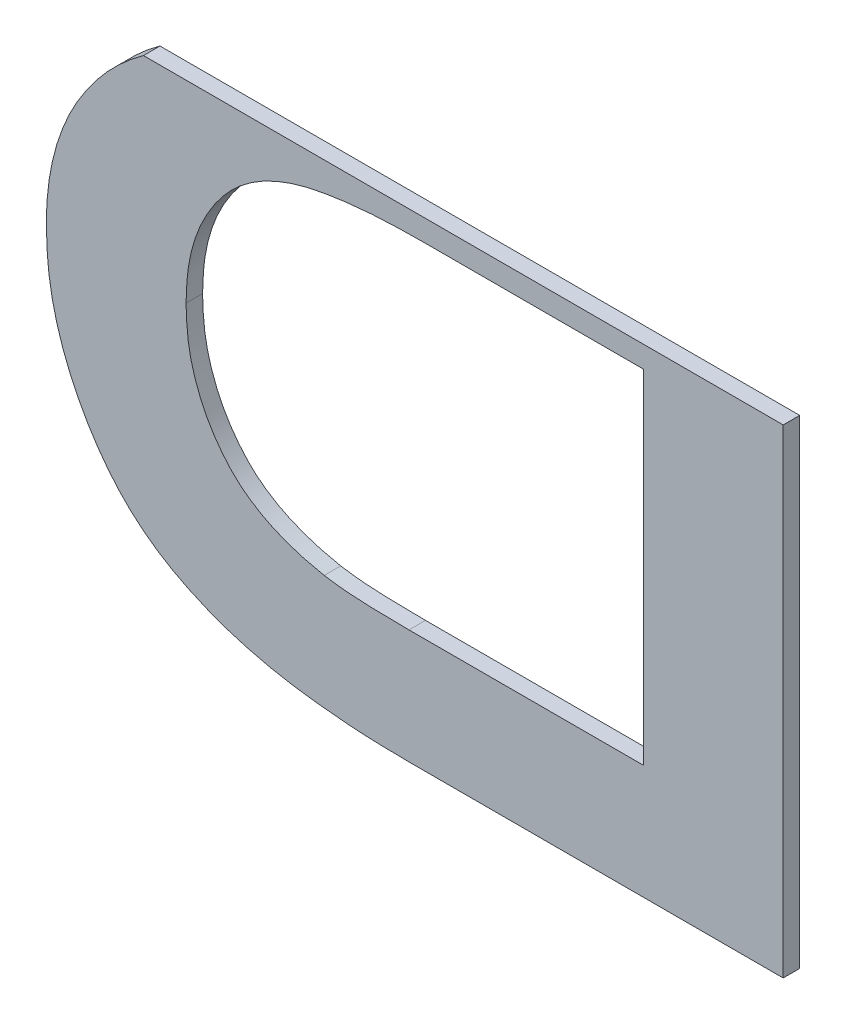
ISO-10303-21;
HEADER;
FILE_DESCRIPTION(('STEP AP214'),'2;1');
FILE_NAME('part.step','',(''),(''),'','','');
FILE_SCHEMA(('AUTOMOTIVE_DESIGN { 1 0 10303 214 1 1 1 1 }'));
ENDSEC;
DATA;
#1=APPLICATION_CONTEXT('core data for automotive mechanical design processes');
#2=APPLICATION_PROTOCOL_DEFINITION('international standard','automotive_design',2000,#1);
#3=PRODUCT_CONTEXT('',#1,'mechanical');
#4=PRODUCT('Part','Part','',(#3));
#5=PRODUCT_RELATED_PRODUCT_CATEGORY('part','',(#4));
#6=PRODUCT_DEFINITION_FORMATION('','',#4);
#7=PRODUCT_DEFINITION_CONTEXT('part definition',#1,'design');
#8=PRODUCT_DEFINITION('design','',#6,#7);
#9=PRODUCT_DEFINITION_SHAPE('','',#8);
#10=(LENGTH_UNIT() NAMED_UNIT(*) SI_UNIT(.MILLI.,.METRE.));
#11=(NAMED_UNIT(*) PLANE_ANGLE_UNIT() SI_UNIT($,.RADIAN.));
#12=(NAMED_UNIT(*) SI_UNIT($,.STERADIAN.) SOLID_ANGLE_UNIT());
#13=UNCERTAINTY_MEASURE_WITH_UNIT(LENGTH_MEASURE(1.E-05),#10,'distance_accuracy_value','');
#14=(GEOMETRIC_REPRESENTATION_CONTEXT(3) GLOBAL_UNCERTAINTY_ASSIGNED_CONTEXT((#13)) GLOBAL_UNIT_ASSIGNED_CONTEXT((#10,
#11,#12)) REPRESENTATION_CONTEXT('',''));
#15=CARTESIAN_POINT('',(0.,0.,0.));
#16=DIRECTION('',(0.,0.,1.));
#17=DIRECTION('',(1.,0.,0.));
#18=AXIS2_PLACEMENT_3D('',#15,#16,#17);
#19=CARTESIAN_POINT('',(-0.87740384615383,-15.,0.5));
#20=DIRECTION('',(0.,1.,0.));
#21=DIRECTION('',(0.,0.,1.));
#22=AXIS2_PLACEMENT_3D('',#19,#20,#21);
#23=PLANE('',#22);
#24=DIRECTION('',(1.,0.,0.));
#25=VECTOR('',#24,1.);
#26=CARTESIAN_POINT('',(-0.87740384615383,-15.,0.));
#27=LINE('',#26,#25);
#28=CARTESIAN_POINT('',(-0.87740384615383,-15.,0.));
#29=VERTEX_POINT('',#28);
#30=CARTESIAN_POINT('',(10.3846153846154,-15.,0.));
#31=VERTEX_POINT('',#30);
#32=EDGE_CURVE('E177',#29,#31,#27,.T.);
#33=ORIENTED_EDGE('',*,*,#32,.T.);
#34=DIRECTION('',(0.,0.,-1.));
#35=VECTOR('',#34,1.);
#36=CARTESIAN_POINT('',(10.3846153846154,-15.,0.5));
#37=LINE('',#36,#35);
#38=CARTESIAN_POINT('',(10.3846153846154,-15.,0.5));
#39=VERTEX_POINT('',#38);
#40=EDGE_CURVE('E50',#39,#31,#37,.T.);
#41=ORIENTED_EDGE('',*,*,#40,.F.);
#42=DIRECTION('',(1.,0.,0.));
#43=VECTOR('',#42,1.);
#44=CARTESIAN_POINT('',(-0.87740384615383,-15.,0.5));
#45=LINE('',#44,#43);
#46=CARTESIAN_POINT('',(-0.87740384615383,-15.,0.5));
#47=VERTEX_POINT('',#46);
#48=EDGE_CURVE('E184',#47,#39,#45,.T.);
#49=ORIENTED_EDGE('',*,*,#48,.F.);
#50=DIRECTION('',(0.,0.,-1.));
#51=VECTOR('',#50,1.);
#52=CARTESIAN_POINT('',(-0.87740384615383,-15.,0.5));
#53=LINE('',#52,#51);
#54=EDGE_CURVE('E236',#47,#29,#53,.T.);
#55=ORIENTED_EDGE('',*,*,#54,.T.);
#56=EDGE_LOOP('',(#33,#41,#49,#55));
#57=FACE_BOUND('',#56,.T.);
#58=ADVANCED_FACE('F39',(#57),#23,.F.);
#59=CARTESIAN_POINT('',(-11.9230769230769,-6.40625,0.5));
#60=CARTESIAN_POINT('',(-11.9127136098471,-6.74740615710977,0.5));
#61=CARTESIAN_POINT('',(-11.8921722620428,-7.42361917155214,0.5));
#62=CARTESIAN_POINT('',(-11.7272023393271,-8.41889101099329,0.5));
#63=CARTESIAN_POINT('',(-11.4484119168482,-9.37625863808368,0.5));
#64=CARTESIAN_POINT('',(-11.0646806102606,-10.2802425752598,0.5));
#65=CARTESIAN_POINT('',(-10.6074493120324,-11.1161088150885,0.5));
#66=CARTESIAN_POINT('',(-10.0877899219767,-11.8619716542824,0.5));
#67=CARTESIAN_POINT('',(-9.51895482982165,-12.510156215647,0.5));
#68=CARTESIAN_POINT('',(-8.88492622407237,-13.0553952893425,0.5));
#69=CARTESIAN_POINT('',(-8.18979386125038,-13.5181437047343,0.5));
#70=CARTESIAN_POINT('',(-7.41392426219032,-13.9078081331658,0.5));
#71=CARTESIAN_POINT('',(-6.56331631031054,-14.2514548164178,0.5));
#72=CARTESIAN_POINT('',(-5.62068187340549,-14.5259724726136,0.5));
#73=CARTESIAN_POINT('',(-4.58645003649169,-14.7440489408712,0.5));
#74=CARTESIAN_POINT('',(-3.44658532556961,-14.8857335773951,0.5));
#75=CARTESIAN_POINT('',(-2.19933651017102,-14.9871607833563,0.5));
#76=CARTESIAN_POINT('',(-1.33036304991544,-14.9956006523584,0.5));
#77=CARTESIAN_POINT('',(-0.87740384615383,-15.,0.5));
#78=B_SPLINE_CURVE_WITH_KNOTS('',3,(#59,#60,#61,#62,#63,#64,#65,#66,#67,#68,#69,#70,#71,#72,#73,
#74,#75,#76,#77),.UNSPECIFIED.,.F.,.F.,(4,1,1,1,1,1,1,1,1,1,1,1,1,1,1,1,4),(0.,
0.064254575424703,0.127360386832097,0.189471842092642,0.251720762933201,0.312027284089002,
0.368674657115051,0.422681491805549,0.474060425225151,0.525773772273917,0.579622104857714,
0.637375285530866,0.698400381820801,0.764357331012258,0.836314767979149,0.914677794254047,1.),.UNSPECIFIED.);
#79=DIRECTION('',(0.,0.,-1.));
#80=VECTOR('',#79,1.);
#81=SURFACE_OF_LINEAR_EXTRUSION('',#78,#80);
#82=CARTESIAN_POINT('',(-11.9230769230769,-6.40625,0.));
#83=CARTESIAN_POINT('',(-11.9127136098471,-6.74740615710977,0.));
#84=CARTESIAN_POINT('',(-11.8921722620428,-7.42361917155214,0.));
#85=CARTESIAN_POINT('',(-11.7272023393271,-8.41889101099329,0.));
#86=CARTESIAN_POINT('',(-11.4484119168482,-9.37625863808368,0.));
#87=CARTESIAN_POINT('',(-11.0646806102606,-10.2802425752598,0.));
#88=CARTESIAN_POINT('',(-10.6074493120324,-11.1161088150885,0.));
#89=CARTESIAN_POINT('',(-10.0877899219767,-11.8619716542824,0.));
#90=CARTESIAN_POINT('',(-9.51895482982165,-12.510156215647,0.));
#91=CARTESIAN_POINT('',(-8.88492622407237,-13.0553952893425,0.));
#92=CARTESIAN_POINT('',(-8.18979386125038,-13.5181437047343,0.));
#93=CARTESIAN_POINT('',(-7.41392426219032,-13.9078081331658,0.));
#94=CARTESIAN_POINT('',(-6.56331631031054,-14.2514548164178,0.));
#95=CARTESIAN_POINT('',(-5.62068187340549,-14.5259724726136,0.));
#96=CARTESIAN_POINT('',(-4.58645003649169,-14.7440489408712,0.));
#97=CARTESIAN_POINT('',(-3.44658532556961,-14.8857335773951,0.));
#98=CARTESIAN_POINT('',(-2.19933651017102,-14.9871607833563,0.));
#99=CARTESIAN_POINT('',(-1.33036304991544,-14.9956006523584,0.));
#100=CARTESIAN_POINT('',(-0.87740384615383,-15.,0.));
#101=B_SPLINE_CURVE_WITH_KNOTS('',3,(#82,#83,#84,#85,#86,#87,#88,#89,#90,#91,#92,#93,#94,#95,
#96,#97,#98,#99,#100),.UNSPECIFIED.,.F.,.F.,(4,1,1,1,1,1,1,1,1,1,1,1,1,1,1,1,4),(0.,
0.064254575424703,0.127360386832097,0.189471842092642,0.251720762933201,0.312027284089002,
0.368674657115051,0.422681491805549,0.474060425225151,0.525773772273917,0.579622104857714,
0.637375285530866,0.698400381820801,0.764357331012258,0.836314767979149,0.914677794254047,1.),.UNSPECIFIED.);
#102=CARTESIAN_POINT('',(-11.9230769230769,-6.40625,0.));
#103=VERTEX_POINT('',#102);
#104=EDGE_CURVE('E189',#103,#29,#101,.T.);
#105=ORIENTED_EDGE('',*,*,#104,.T.);
#106=ORIENTED_EDGE('',*,*,#54,.F.);
#107=CARTESIAN_POINT('',(-11.9230769230769,-6.40625,0.5));
#108=VERTEX_POINT('',#107);
#109=EDGE_CURVE('E198',#108,#47,#78,.T.);
#110=ORIENTED_EDGE('',*,*,#109,.F.);
#111=DIRECTION('',(0.,0.,-1.));
#112=VECTOR('',#111,1.);
#113=CARTESIAN_POINT('',(-11.9230769230769,-6.40625,0.5));
#114=LINE('',#113,#112);
#115=EDGE_CURVE('E260',#108,#103,#114,.T.);
#116=ORIENTED_EDGE('',*,*,#115,.T.);
#117=EDGE_LOOP('',(#105,#106,#110,#116));
#118=FACE_BOUND('',#117,.T.);
#119=ADVANCED_FACE('F211',(#118),#81,.F.);
#120=CARTESIAN_POINT('',(-7.69230769230768,-6.34615384615385,0.5));
#121=CARTESIAN_POINT('',(-7.68402965650566,-6.072990902786,0.5));
#122=CARTESIAN_POINT('',(-7.66788664165634,-5.54029527830023,0.5));
#123=CARTESIAN_POINT('',(-7.51444174955307,-4.77052311111662,0.5));
#124=CARTESIAN_POINT('',(-7.26097589926788,-4.05654985522834,0.5));
#125=CARTESIAN_POINT('',(-6.90416983793468,-3.4082633227946,0.5));
#126=CARTESIAN_POINT('',(-6.4665285785219,-2.82518540218742,0.5));
#127=CARTESIAN_POINT('',(-5.93702684595805,-2.33057627418232,0.5));
#128=CARTESIAN_POINT('',(-5.31962392480921,-1.93807947037736,0.5));
#129=CARTESIAN_POINT('',(-4.61242228339407,-1.63004544170201,0.5));
#130=CARTESIAN_POINT('',(-3.78584522507848,-1.41088453555847,0.5));
#131=CARTESIAN_POINT('',(-2.81707259911163,-1.26219713569727,0.5));
#132=CARTESIAN_POINT('',(-1.69060858413864,-1.16625272057358,0.5));
#133=CARTESIAN_POINT('',(-0.885639332551208,-1.15815880348334,0.5));
#134=CARTESIAN_POINT('',(-0.456730769230753,-1.15384615384615,0.5));
#135=B_SPLINE_CURVE_WITH_KNOTS('',3,(#120,#121,#122,#123,#124,#125,#126,#127,#128,#129,#130,
#131,#132,#133,#134),.UNSPECIFIED.,.F.,.F.,(4,1,1,1,1,1,1,1,1,1,1,1,4),(0.,0.0801399024652514,
0.156280990619094,0.229406049012902,0.301798696972306,0.372742862769578,0.442667609902629,
0.513320964612698,0.586547692363209,0.668322508229505,0.763676625525905,0.874080756718548,1.),.UNSPECIFIED.);
#136=DIRECTION('',(0.,0.,-1.));
#137=VECTOR('',#136,1.);
#138=SURFACE_OF_LINEAR_EXTRUSION('',#135,#137);
#139=CARTESIAN_POINT('',(-7.69230769230768,-6.34615384615385,0.));
#140=CARTESIAN_POINT('',(-7.68402965650566,-6.072990902786,0.));
#141=CARTESIAN_POINT('',(-7.66788664165634,-5.54029527830023,0.));
#142=CARTESIAN_POINT('',(-7.51444174955307,-4.77052311111662,0.));
#143=CARTESIAN_POINT('',(-7.26097589926788,-4.05654985522834,0.));
#144=CARTESIAN_POINT('',(-6.90416983793468,-3.4082633227946,0.));
#145=CARTESIAN_POINT('',(-6.4665285785219,-2.82518540218742,0.));
#146=CARTESIAN_POINT('',(-5.93702684595805,-2.33057627418232,0.));
#147=CARTESIAN_POINT('',(-5.31962392480921,-1.93807947037736,0.));
#148=CARTESIAN_POINT('',(-4.61242228339407,-1.63004544170201,0.));
#149=CARTESIAN_POINT('',(-3.78584522507848,-1.41088453555847,0.));
#150=CARTESIAN_POINT('',(-2.81707259911163,-1.26219713569727,0.));
#151=CARTESIAN_POINT('',(-1.69060858413864,-1.16625272057358,0.));
#152=CARTESIAN_POINT('',(-0.885639332551208,-1.15815880348334,0.));
#153=CARTESIAN_POINT('',(-0.456730769230753,-1.15384615384615,0.));
#154=B_SPLINE_CURVE_WITH_KNOTS('',3,(#139,#140,#141,#142,#143,#144,#145,#146,#147,#148,#149,
#150,#151,#152,#153),.UNSPECIFIED.,.F.,.F.,(4,1,1,1,1,1,1,1,1,1,1,1,4),(0.,0.0801399024652514,
0.156280990619094,0.229406049012902,0.301798696972306,0.372742862769578,0.442667609902629,
0.513320964612698,0.586547692363209,0.668322508229505,0.763676625525905,0.874080756718548,1.),.UNSPECIFIED.);
#155=CARTESIAN_POINT('',(-7.69230769230768,-6.34615384615385,0.));
#156=VERTEX_POINT('',#155);
#157=CARTESIAN_POINT('',(-0.456730769230753,-1.15384615384615,0.));
#158=VERTEX_POINT('',#157);
#159=EDGE_CURVE('E161',#156,#158,#154,.T.);
#160=ORIENTED_EDGE('',*,*,#159,.T.);
#161=DIRECTION('',(0.,0.,-1.));
#162=VECTOR('',#161,1.);
#163=CARTESIAN_POINT('',(-0.456730769230753,-1.15384615384615,0.5));
#164=LINE('',#163,#162);
#165=CARTESIAN_POINT('',(-0.456730769230753,-1.15384615384615,0.5));
#166=VERTEX_POINT('',#165);
#167=EDGE_CURVE('E180',#166,#158,#164,.T.);
#168=ORIENTED_EDGE('',*,*,#167,.F.);
#169=CARTESIAN_POINT('',(-7.69230769230768,-6.34615384615385,0.5));
#170=VERTEX_POINT('',#169);
#171=EDGE_CURVE('E309',#170,#166,#135,.T.);
#172=ORIENTED_EDGE('',*,*,#171,.F.);
#173=DIRECTION('',(0.,0.,-1.));
#174=VECTOR('',#173,1.);
#175=CARTESIAN_POINT('',(-7.69230769230768,-6.34615384615385,0.5));
#176=LINE('',#175,#174);
#177=EDGE_CURVE('E176',#170,#156,#176,.T.);
#178=ORIENTED_EDGE('',*,*,#177,.T.);
#179=EDGE_LOOP('',(#160,#168,#172,#178));
#180=FACE_BOUND('',#179,.T.);
#181=ADVANCED_FACE('F226',(#180),#138,.F.);
#182=CARTESIAN_POINT('',(-3.50961538461537,-11.3942307692308,0.5));
#183=CARTESIAN_POINT('',(-3.71902189553086,-11.3502156425218,0.5));
#184=CARTESIAN_POINT('',(-4.12448704089734,-11.2649909774845,0.5));
#185=CARTESIAN_POINT('',(-4.69609561025089,-11.0747784162755,0.5));
#186=CARTESIAN_POINT('',(-5.22018840416219,-10.8568797896636,0.5));
#187=CARTESIAN_POINT('',(-5.6876181747977,-10.5799548426517,0.5));
#188=CARTESIAN_POINT('',(-6.12044692765416,-10.2608178112071,0.5));
#189=CARTESIAN_POINT('',(-6.49660732750269,-9.86220038641394,0.5));
#190=CARTESIAN_POINT('',(-6.84306891131073,-9.4093034982535,0.5));
#191=CARTESIAN_POINT('',(-7.1432473709768,-8.89101452766293,0.5));
#192=CARTESIAN_POINT('',(-7.38598524272694,-8.3176488367938,0.5));
#193=CARTESIAN_POINT('',(-7.57150564507397,-7.69806532954253,0.5));
#194=CARTESIAN_POINT('',(-7.67032732427288,-7.0344363965105,0.5));
#195=CARTESIAN_POINT('',(-7.68487750572045,-6.57881909387779,0.5));
#196=CARTESIAN_POINT('',(-7.69230769230768,-6.34615384615385,0.5));
#197=B_SPLINE_CURVE_WITH_KNOTS('',3,(#182,#183,#184,#185,#186,#187,#188,#189,#190,#191,#192,
#193,#194,#195,#196),.UNSPECIFIED.,.F.,.F.,(4,1,1,1,1,1,1,1,1,1,1,1,4),(0.,0.0889709576989544,
0.172270776773314,0.25031203046371,0.324655199621551,0.397844450180294,0.473300880718533,
0.551825888744448,0.634749483498253,0.721766011892386,0.810392665561119,0.903175236799419,1.),.UNSPECIFIED.);
#198=DIRECTION('',(0.,0.,-1.));
#199=VECTOR('',#198,1.);
#200=SURFACE_OF_LINEAR_EXTRUSION('',#197,#199);
#201=CARTESIAN_POINT('',(-3.50961538461537,-11.3942307692308,0.));
#202=CARTESIAN_POINT('',(-3.71902189553086,-11.3502156425218,0.));
#203=CARTESIAN_POINT('',(-4.12448704089734,-11.2649909774845,0.));
#204=CARTESIAN_POINT('',(-4.69609561025089,-11.0747784162755,0.));
#205=CARTESIAN_POINT('',(-5.22018840416219,-10.8568797896636,0.));
#206=CARTESIAN_POINT('',(-5.6876181747977,-10.5799548426517,0.));
#207=CARTESIAN_POINT('',(-6.12044692765416,-10.2608178112071,0.));
#208=CARTESIAN_POINT('',(-6.49660732750269,-9.86220038641394,0.));
#209=CARTESIAN_POINT('',(-6.84306891131073,-9.4093034982535,0.));
#210=CARTESIAN_POINT('',(-7.1432473709768,-8.89101452766293,0.));
#211=CARTESIAN_POINT('',(-7.38598524272694,-8.3176488367938,0.));
#212=CARTESIAN_POINT('',(-7.57150564507397,-7.69806532954253,0.));
#213=CARTESIAN_POINT('',(-7.67032732427288,-7.0344363965105,0.));
#214=CARTESIAN_POINT('',(-7.68487750572045,-6.57881909387779,0.));
#215=CARTESIAN_POINT('',(-7.69230769230768,-6.34615384615385,0.));
#216=B_SPLINE_CURVE_WITH_KNOTS('',3,(#201,#202,#203,#204,#205,#206,#207,#208,#209,#210,#211,
#212,#213,#214,#215),.UNSPECIFIED.,.F.,.F.,(4,1,1,1,1,1,1,1,1,1,1,1,4),(0.,0.0889709576989544,
0.172270776773314,0.25031203046371,0.324655199621551,0.397844450180294,0.473300880718533,
0.551825888744448,0.634749483498253,0.721766011892386,0.810392665561119,0.903175236799419,1.),.UNSPECIFIED.);
#217=CARTESIAN_POINT('',(-3.50961538461537,-11.3942307692308,0.));
#218=VERTEX_POINT('',#217);
#219=EDGE_CURVE('E146',#218,#156,#216,.T.);
#220=ORIENTED_EDGE('',*,*,#219,.T.);
#221=ORIENTED_EDGE('',*,*,#177,.F.);
#222=CARTESIAN_POINT('',(-3.50961538461537,-11.3942307692308,0.5));
#223=VERTEX_POINT('',#222);
#224=EDGE_CURVE('E277',#223,#170,#197,.T.);
#225=ORIENTED_EDGE('',*,*,#224,.F.);
#226=DIRECTION('',(0.,0.,-1.));
#227=VECTOR('',#226,1.);
#228=CARTESIAN_POINT('',(-3.50961538461537,-11.3942307692308,0.5));
#229=LINE('',#228,#227);
#230=EDGE_CURVE('E182',#223,#218,#229,.T.);
#231=ORIENTED_EDGE('',*,*,#230,.T.);
#232=EDGE_LOOP('',(#220,#221,#225,#231));
#233=FACE_BOUND('',#232,.T.);
#234=ADVANCED_FACE('F286',(#233),#200,.F.);
#235=CARTESIAN_POINT('',(-0.9435096153846,-11.5384615384615,0.5));
#236=CARTESIAN_POINT('',(-1.22596800207187,-11.535216491434,0.5));
#237=CARTESIAN_POINT('',(-1.74492198786115,-11.5292544447453,0.5));
#238=CARTESIAN_POINT('',(-2.45474965186769,-11.5105512141193,0.5));
#239=CARTESIAN_POINT('',(-3.02850986046935,-11.4648662180359,0.5));
#240=CARTESIAN_POINT('',(-3.36355550188859,-11.4156751402701,0.5));
#241=CARTESIAN_POINT('',(-3.50961538461537,-11.3942307692308,0.5));
#242=B_SPLINE_CURVE_WITH_KNOTS('',3,(#235,#236,#237,#238,#239,#240,#241),.UNSPECIFIED.,.F.,.F.,
(4,1,1,1,4),(0.,0.329395464129183,0.605190346852801,0.827886578694735,1.),.UNSPECIFIED.);
#243=DIRECTION('',(0.,0.,-1.));
#244=VECTOR('',#243,1.);
#245=SURFACE_OF_LINEAR_EXTRUSION('',#242,#244);
#246=CARTESIAN_POINT('',(-0.9435096153846,-11.5384615384615,0.));
#247=CARTESIAN_POINT('',(-1.22596800207187,-11.535216491434,0.));
#248=CARTESIAN_POINT('',(-1.74492198786115,-11.5292544447453,0.));
#249=CARTESIAN_POINT('',(-2.45474965186769,-11.5105512141193,0.));
#250=CARTESIAN_POINT('',(-3.02850986046935,-11.4648662180359,0.));
#251=CARTESIAN_POINT('',(-3.36355550188859,-11.4156751402701,0.));
#252=CARTESIAN_POINT('',(-3.50961538461537,-11.3942307692308,0.));
#253=B_SPLINE_CURVE_WITH_KNOTS('',3,(#246,#247,#248,#249,#250,#251,#252),.UNSPECIFIED.,.F.,.F.,
(4,1,1,1,4),(0.,0.329395464129183,0.605190346852801,0.827886578694735,1.),.UNSPECIFIED.);
#254=CARTESIAN_POINT('',(-0.9435096153846,-11.5384615384615,0.));
#255=VERTEX_POINT('',#254);
#256=EDGE_CURVE('E148',#255,#218,#253,.T.);
#257=ORIENTED_EDGE('',*,*,#256,.T.);
#258=ORIENTED_EDGE('',*,*,#230,.F.);
#259=CARTESIAN_POINT('',(-0.9435096153846,-11.5384615384615,0.5));
#260=VERTEX_POINT('',#259);
#261=EDGE_CURVE('E269',#260,#223,#242,.T.);
#262=ORIENTED_EDGE('',*,*,#261,.F.);
#263=DIRECTION('',(0.,0.,-1.));
#264=VECTOR('',#263,1.);
#265=CARTESIAN_POINT('',(-0.9435096153846,-11.5384615384615,0.5));
#266=LINE('',#265,#264);
#267=EDGE_CURVE('E138',#260,#255,#266,.T.);
#268=ORIENTED_EDGE('',*,*,#267,.T.);
#269=EDGE_LOOP('',(#257,#258,#262,#268));
#270=FACE_BOUND('',#269,.T.);
#271=ADVANCED_FACE('F283',(#270),#245,.F.);
#272=CARTESIAN_POINT('',(6.15384615384617,-11.5384615384615,0.5));
#273=DIRECTION('',(0.,-1.,0.));
#274=DIRECTION('',(0.,0.,-1.));
#275=AXIS2_PLACEMENT_3D('',#272,#273,#274);
#276=PLANE('',#275);
#277=DIRECTION('',(-1.,0.,0.));
#278=VECTOR('',#277,1.);
#279=CARTESIAN_POINT('',(6.15384615384617,-11.5384615384615,0.));
#280=LINE('',#279,#278);
#281=CARTESIAN_POINT('',(6.15384615384617,-11.5384615384615,0.));
#282=VERTEX_POINT('',#281);
#283=EDGE_CURVE('E128',#282,#255,#280,.T.);
#284=ORIENTED_EDGE('',*,*,#283,.T.);
#285=ORIENTED_EDGE('',*,*,#267,.F.);
#286=DIRECTION('',(-1.,0.,0.));
#287=VECTOR('',#286,1.);
#288=CARTESIAN_POINT('',(6.15384615384617,-11.5384615384615,0.5));
#289=LINE('',#288,#287);
#290=CARTESIAN_POINT('',(6.15384615384617,-11.5384615384615,0.5));
#291=VERTEX_POINT('',#290);
#292=EDGE_CURVE('E139',#291,#260,#289,.T.);
#293=ORIENTED_EDGE('',*,*,#292,.F.);
#294=DIRECTION('',(0.,0.,-1.));
#295=VECTOR('',#294,1.);
#296=CARTESIAN_POINT('',(6.15384615384617,-11.5384615384615,0.5));
#297=LINE('',#296,#295);
#298=EDGE_CURVE('E124',#291,#282,#297,.T.);
#299=ORIENTED_EDGE('',*,*,#298,.T.);
#300=EDGE_LOOP('',(#284,#285,#293,#299));
#301=FACE_BOUND('',#300,.T.);
#302=ADVANCED_FACE('F131',(#301),#276,.F.);
#303=CARTESIAN_POINT('',(6.15384615384617,-1.15384615384615,0.5));
#304=DIRECTION('',(1.,0.,0.));
#305=DIRECTION('',(0.,0.,-1.));
#306=AXIS2_PLACEMENT_3D('',#303,#304,#305);
#307=PLANE('',#306);
#308=DIRECTION('',(0.,-1.,0.));
#309=VECTOR('',#308,1.);
#310=CARTESIAN_POINT('',(6.15384615384617,-1.15384615384615,0.));
#311=LINE('',#310,#309);
#312=CARTESIAN_POINT('',(6.15384615384617,-1.15384615384615,0.));
#313=VERTEX_POINT('',#312);
#314=EDGE_CURVE('E116',#313,#282,#311,.T.);
#315=ORIENTED_EDGE('',*,*,#314,.T.);
#316=ORIENTED_EDGE('',*,*,#298,.F.);
#317=DIRECTION('',(0.,-1.,0.));
#318=VECTOR('',#317,1.);
#319=CARTESIAN_POINT('',(6.15384615384617,-1.15384615384615,0.5));
#320=LINE('',#319,#318);
#321=CARTESIAN_POINT('',(6.15384615384617,-1.15384615384615,0.5));
#322=VERTEX_POINT('',#321);
#323=EDGE_CURVE('E171',#322,#291,#320,.T.);
#324=ORIENTED_EDGE('',*,*,#323,.F.);
#325=DIRECTION('',(0.,0.,-1.));
#326=VECTOR('',#325,1.);
#327=CARTESIAN_POINT('',(6.15384615384617,-1.15384615384615,0.5));
#328=LINE('',#327,#326);
#329=EDGE_CURVE('E123',#322,#313,#328,.T.);
#330=ORIENTED_EDGE('',*,*,#329,.T.);
#331=EDGE_LOOP('',(#315,#316,#324,#330));
#332=FACE_BOUND('',#331,.T.);
#333=ADVANCED_FACE('F122',(#332),#307,.F.);
#334=CARTESIAN_POINT('',(-0.456730769230753,-1.15384615384615,0.5));
#335=DIRECTION('',(0.,1.,0.));
#336=DIRECTION('',(0.,0.,1.));
#337=AXIS2_PLACEMENT_3D('',#334,#335,#336);
#338=PLANE('',#337);
#339=DIRECTION('',(1.,0.,0.));
#340=VECTOR('',#339,1.);
#341=CARTESIAN_POINT('',(-0.456730769230753,-1.15384615384615,0.));
#342=LINE('',#341,#340);
#343=EDGE_CURVE('E166',#158,#313,#342,.T.);
#344=ORIENTED_EDGE('',*,*,#343,.T.);
#345=ORIENTED_EDGE('',*,*,#329,.F.);
#346=DIRECTION('',(1.,0.,0.));
#347=VECTOR('',#346,1.);
#348=CARTESIAN_POINT('',(-0.456730769230753,-1.15384615384615,0.5));
#349=LINE('',#348,#347);
#350=EDGE_CURVE('E143',#166,#322,#349,.T.);
#351=ORIENTED_EDGE('',*,*,#350,.F.);
#352=ORIENTED_EDGE('',*,*,#167,.T.);
#353=EDGE_LOOP('',(#344,#345,#351,#352));
#354=FACE_BOUND('',#353,.T.);
#355=ADVANCED_FACE('F297',(#354),#338,.F.);
#356=CARTESIAN_POINT('',(-7.64723066789635,13.3359684193892,0.5));
#357=DIRECTION('',(0.,0.,-1.));
#358=DIRECTION('',(-1.,0.,0.));
#359=AXIS2_PLACEMENT_3D('',#356,#357,#358);
#360=PLANE('',#359);
#361=ORIENTED_EDGE('',*,*,#350,.T.);
#362=ORIENTED_EDGE('',*,*,#323,.T.);
#363=ORIENTED_EDGE('',*,*,#292,.T.);
#364=ORIENTED_EDGE('',*,*,#261,.T.);
#365=ORIENTED_EDGE('',*,*,#224,.T.);
#366=ORIENTED_EDGE('',*,*,#171,.T.);
#367=EDGE_LOOP('',(#361,#362,#363,#364,#365,#366));
#368=FACE_BOUND('',#367,.T.);
#369=DIRECTION('',(0.,1.,0.));
#370=VECTOR('',#369,1.);
#371=CARTESIAN_POINT('',(10.3846153846154,-15.,0.5));
#372=LINE('',#371,#370);
#373=CARTESIAN_POINT('',(10.3846153846154,-0.5,0.5));
#374=VERTEX_POINT('',#373);
#375=EDGE_CURVE('E190',#39,#374,#372,.T.);
#376=ORIENTED_EDGE('',*,*,#375,.T.);
#377=DIRECTION('',(-1.,0.,0.));
#378=VECTOR('',#377,1.);
#379=CARTESIAN_POINT('',(-7.64723066789635,-0.5,0.5));
#380=LINE('',#379,#378);
#381=CARTESIAN_POINT('',(-8.98196798905523,-0.499999995787601,0.5));
#382=VERTEX_POINT('',#381);
#383=EDGE_CURVE('E69',#374,#382,#380,.T.);
#384=ORIENTED_EDGE('',*,*,#383,.T.);
#385=CARTESIAN_POINT('',(-6.26802884615383,0.769230769230767,0.5));
#386=CARTESIAN_POINT('',(-6.48935337629664,0.69994669989176,0.5));
#387=CARTESIAN_POINT('',(-6.92266915021833,0.564300280099506,0.5));
#388=CARTESIAN_POINT('',(-7.545605590068,0.316086357587657,0.5));
#389=CARTESIAN_POINT('',(-8.13035265869001,0.0334592836853494,0.5));
#390=CARTESIAN_POINT('',(-8.67818318902735,-0.284045377816053,0.5));
#391=CARTESIAN_POINT('',(-9.18539555947551,-0.639367876477473,0.5));
#392=CARTESIAN_POINT('',(-9.65055860549428,-1.03306214062108,0.5));
#393=CARTESIAN_POINT('',(-10.0768975666602,-1.45903585409812,0.5));
#394=CARTESIAN_POINT('',(-10.4636507466195,-1.91702990224003,0.5));
#395=CARTESIAN_POINT('',(-10.8033728394625,-2.40409699560683,0.5));
#396=CARTESIAN_POINT('',(-11.1080611169842,-2.90959177113516,0.5));
#397=CARTESIAN_POINT('',(-11.359659442595,-3.43960149986684,0.5));
#398=CARTESIAN_POINT('',(-11.5658854279642,-3.99275014392328,0.5));
#399=CARTESIAN_POINT('',(-11.7267723554623,-4.56561972732954,0.5));
#400=CARTESIAN_POINT('',(-11.8423066822912,-5.16041360893499,0.5));
#401=CARTESIAN_POINT('',(-11.9081582988844,-5.77574728947702,0.5));
#402=CARTESIAN_POINT('',(-11.9180490013908,-6.19375599180716,0.5));
#403=CARTESIAN_POINT('',(-11.9230769230769,-6.40625,0.5));
#404=B_SPLINE_CURVE_WITH_KNOTS('',3,(#385,#386,#387,#388,#389,#390,#391,#392,#393,#394,#395,
#396,#397,#398,#399,#400,#401,#402,#403),.UNSPECIFIED.,.F.,.F.,(4,1,1,1,1,1,1,1,1,1,1,1,1,1,1,1,
4),(0.,0.0704642259291747,0.137956965604269,0.203578563614284,0.267691680244943,
0.330185864859375,0.39153376408982,0.452663773487035,0.513153788089214,0.573453553100029,
0.632967559389193,0.692331907420622,0.75147419157163,0.81218744552943,0.872961717848316,
0.935420306759491,1.),.UNSPECIFIED.);
#405=EDGE_CURVE('E192',#382,#108,#404,.T.);
#406=ORIENTED_EDGE('',*,*,#405,.T.);
#407=ORIENTED_EDGE('',*,*,#109,.T.);
#408=ORIENTED_EDGE('',*,*,#48,.T.);
#409=EDGE_LOOP('',(#376,#384,#406,#407,#408));
#410=FACE_BOUND('',#409,.T.);
#411=ADVANCED_FACE('F207',(#368,#410),#360,.F.);
#412=DIRECTION('',(0.,0.,-1.));
#413=VECTOR('',#412,1.);
#414=SURFACE_OF_LINEAR_EXTRUSION('',#404,#413);
#415=ORIENTED_EDGE('',*,*,#405,.F.);
#416=DIRECTION('',(0.,0.,-1.));
#417=VECTOR('',#416,1.);
#418=CARTESIAN_POINT('',(-8.98196799495036,-0.5,0.5));
#419=LINE('',#418,#417);
#420=CARTESIAN_POINT('',(-8.98196799501979,-0.500000000049618,0.));
#421=VERTEX_POINT('',#420);
#422=EDGE_CURVE('E53',#382,#421,#419,.T.);
#423=ORIENTED_EDGE('',*,*,#422,.T.);
#424=CARTESIAN_POINT('',(-6.26802884615383,0.769230769230767,0.));
#425=CARTESIAN_POINT('',(-6.48935337629664,0.69994669989176,0.));
#426=CARTESIAN_POINT('',(-6.92266915021833,0.564300280099506,0.));
#427=CARTESIAN_POINT('',(-7.545605590068,0.316086357587657,0.));
#428=CARTESIAN_POINT('',(-8.13035265869001,0.0334592836853494,0.));
#429=CARTESIAN_POINT('',(-8.67818318902735,-0.284045377816053,0.));
#430=CARTESIAN_POINT('',(-9.18539555947551,-0.639367876477473,0.));
#431=CARTESIAN_POINT('',(-9.65055860549428,-1.03306214062108,0.));
#432=CARTESIAN_POINT('',(-10.0768975666602,-1.45903585409812,0.));
#433=CARTESIAN_POINT('',(-10.4636507466195,-1.91702990224003,0.));
#434=CARTESIAN_POINT('',(-10.8033728394625,-2.40409699560683,0.));
#435=CARTESIAN_POINT('',(-11.1080611169842,-2.90959177113516,0.));
#436=CARTESIAN_POINT('',(-11.359659442595,-3.43960149986684,0.));
#437=CARTESIAN_POINT('',(-11.5658854279642,-3.99275014392328,0.));
#438=CARTESIAN_POINT('',(-11.7267723554623,-4.56561972732954,0.));
#439=CARTESIAN_POINT('',(-11.8423066822912,-5.16041360893499,0.));
#440=CARTESIAN_POINT('',(-11.9081582988844,-5.77574728947702,0.));
#441=CARTESIAN_POINT('',(-11.9180490013908,-6.19375599180716,0.));
#442=CARTESIAN_POINT('',(-11.9230769230769,-6.40625,0.));
#443=B_SPLINE_CURVE_WITH_KNOTS('',3,(#424,#425,#426,#427,#428,#429,#430,#431,#432,#433,#434,
#435,#436,#437,#438,#439,#440,#441,#442),.UNSPECIFIED.,.F.,.F.,(4,1,1,1,1,1,1,1,1,1,1,1,1,1,1,1,
4),(0.,0.0704642259291747,0.137956965604269,0.203578563614284,0.267691680244943,
0.330185864859375,0.39153376408982,0.452663773487035,0.513153788089214,0.573453553100029,
0.632967559389193,0.692331907420622,0.75147419157163,0.81218744552943,0.872961717848316,
0.935420306759491,1.),.UNSPECIFIED.);
#444=EDGE_CURVE('E242',#421,#103,#443,.T.);
#445=ORIENTED_EDGE('',*,*,#444,.T.);
#446=ORIENTED_EDGE('',*,*,#115,.F.);
#447=EDGE_LOOP('',(#415,#423,#445,#446));
#448=FACE_BOUND('',#447,.T.);
#449=ADVANCED_FACE('F202',(#448),#414,.F.);
#450=CARTESIAN_POINT('',(10.3846153846154,-15.,0.5));
#451=DIRECTION('',(-1.,0.,0.));
#452=DIRECTION('',(0.,0.,1.));
#453=AXIS2_PLACEMENT_3D('',#450,#451,#452);
#454=PLANE('',#453);
#455=DIRECTION('',(0.,1.,0.));
#456=VECTOR('',#455,1.);
#457=CARTESIAN_POINT('',(10.3846153846154,-15.,0.));
#458=LINE('',#457,#456);
#459=CARTESIAN_POINT('',(10.3846153846154,-0.5,0.));
#460=VERTEX_POINT('',#459);
#461=EDGE_CURVE('E238',#31,#460,#458,.T.);
#462=ORIENTED_EDGE('',*,*,#461,.T.);
#463=DIRECTION('',(0.,0.,1.));
#464=VECTOR('',#463,1.);
#465=CARTESIAN_POINT('',(10.3846153846154,-0.5,0.5));
#466=LINE('',#465,#464);
#467=EDGE_CURVE('E64',#460,#374,#466,.T.);
#468=ORIENTED_EDGE('',*,*,#467,.T.);
#469=ORIENTED_EDGE('',*,*,#375,.F.);
#470=ORIENTED_EDGE('',*,*,#40,.T.);
#471=EDGE_LOOP('',(#462,#468,#469,#470));
#472=FACE_BOUND('',#471,.T.);
#473=ADVANCED_FACE('F208',(#472),#454,.F.);
#474=CARTESIAN_POINT('',(-7.64723066789635,13.3359684193892,0.));
#475=DIRECTION('',(0.,0.,-1.));
#476=DIRECTION('',(-1.,0.,0.));
#477=AXIS2_PLACEMENT_3D('',#474,#475,#476);
#478=PLANE('',#477);
#479=DIRECTION('',(-1.,0.,0.));
#480=VECTOR('',#479,1.);
#481=CARTESIAN_POINT('',(-7.64723066789635,-0.5,0.));
#482=LINE('',#481,#480);
#483=EDGE_CURVE('E11',#460,#421,#482,.T.);
#484=ORIENTED_EDGE('',*,*,#483,.F.);
#485=ORIENTED_EDGE('',*,*,#461,.F.);
#486=ORIENTED_EDGE('',*,*,#32,.F.);
#487=ORIENTED_EDGE('',*,*,#104,.F.);
#488=ORIENTED_EDGE('',*,*,#444,.F.);
#489=EDGE_LOOP('',(#484,#485,#486,#487,#488));
#490=FACE_BOUND('',#489,.T.);
#491=ORIENTED_EDGE('',*,*,#314,.F.);
#492=ORIENTED_EDGE('',*,*,#343,.F.);
#493=ORIENTED_EDGE('',*,*,#159,.F.);
#494=ORIENTED_EDGE('',*,*,#219,.F.);
#495=ORIENTED_EDGE('',*,*,#256,.F.);
#496=ORIENTED_EDGE('',*,*,#283,.F.);
#497=EDGE_LOOP('',(#491,#492,#493,#494,#495,#496));
#498=FACE_BOUND('',#497,.T.);
#499=ADVANCED_FACE('F141',(#490,#498),#478,.T.);
#500=CARTESIAN_POINT('',(-17.,-0.5,1.));
#501=DIRECTION('',(0.,-1.,0.));
#502=DIRECTION('',(0.,0.,-1.));
#503=AXIS2_PLACEMENT_3D('',#500,#501,#502);
#504=PLANE('',#503);
#505=ORIENTED_EDGE('',*,*,#483,.T.);
#506=ORIENTED_EDGE('',*,*,#422,.F.);
#507=ORIENTED_EDGE('',*,*,#383,.F.);
#508=ORIENTED_EDGE('',*,*,#467,.F.);
#509=EDGE_LOOP('',(#505,#506,#507,#508));
#510=FACE_BOUND('',#509,.T.);
#511=ADVANCED_FACE('F219',(#510),#504,.F.);
#512=CLOSED_SHELL('',(#58,#119,#181,#234,#271,#302,#333,#355,#411,#449,#473,#499,#511));
#513=MANIFOLD_SOLID_BREP('B2',#512);
#514=ADVANCED_BREP_SHAPE_REPRESENTATION('',(#18,#513),#14);
#515=SHAPE_DEFINITION_REPRESENTATION(#9,#514);
ENDSEC;
END-ISO-10303-21;
